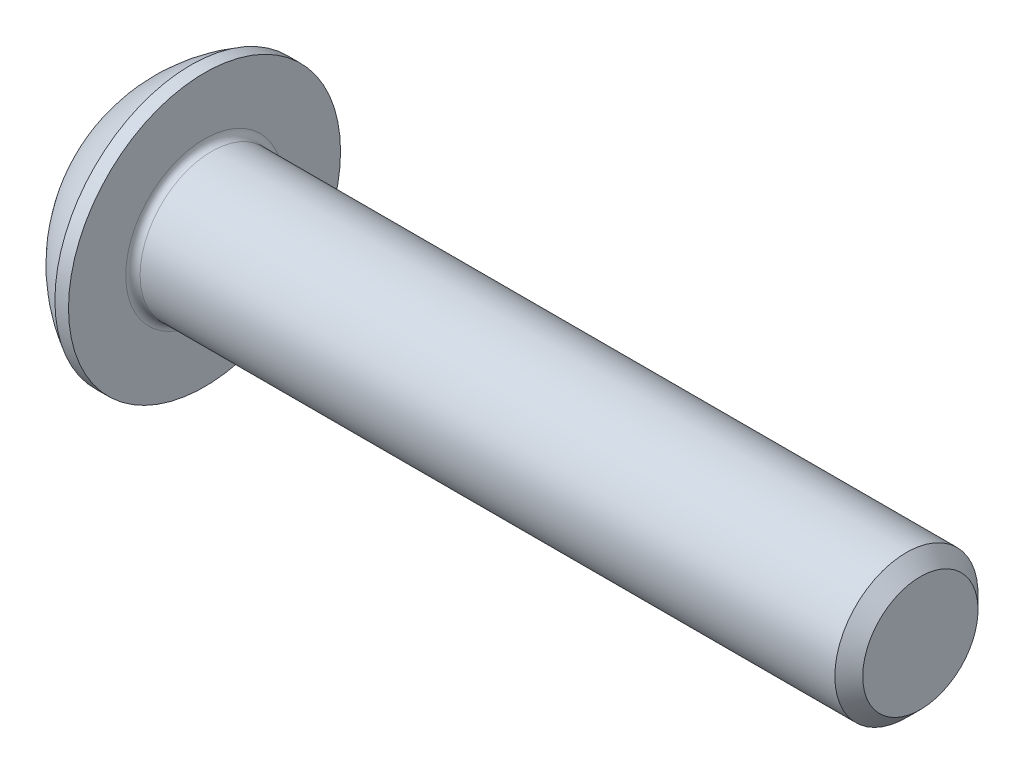
ISO-10303-21;
HEADER;
FILE_DESCRIPTION(('STEP AP214'),'2;1');
FILE_NAME('part.step','',(''),(''),'','','');
FILE_SCHEMA(('AUTOMOTIVE_DESIGN { 1 0 10303 214 1 1 1 1 }'));
ENDSEC;
DATA;
#1=APPLICATION_CONTEXT('core data for automotive mechanical design processes');
#2=APPLICATION_PROTOCOL_DEFINITION('international standard','automotive_design',2000,#1);
#3=PRODUCT_CONTEXT('',#1,'mechanical');
#4=PRODUCT('Part','Part','',(#3));
#5=PRODUCT_RELATED_PRODUCT_CATEGORY('part','',(#4));
#6=PRODUCT_DEFINITION_FORMATION('','',#4);
#7=PRODUCT_DEFINITION_CONTEXT('part definition',#1,'design');
#8=PRODUCT_DEFINITION('design','',#6,#7);
#9=PRODUCT_DEFINITION_SHAPE('','',#8);
#10=(LENGTH_UNIT() NAMED_UNIT(*) SI_UNIT(.MILLI.,.METRE.));
#11=(NAMED_UNIT(*) PLANE_ANGLE_UNIT() SI_UNIT($,.RADIAN.));
#12=(NAMED_UNIT(*) SI_UNIT($,.STERADIAN.) SOLID_ANGLE_UNIT());
#13=UNCERTAINTY_MEASURE_WITH_UNIT(LENGTH_MEASURE(1.E-05),#10,'distance_accuracy_value','');
#14=(GEOMETRIC_REPRESENTATION_CONTEXT(3) GLOBAL_UNCERTAINTY_ASSIGNED_CONTEXT((#13)) GLOBAL_UNIT_ASSIGNED_CONTEXT((#10,
#11,#12)) REPRESENTATION_CONTEXT('',''));
#15=CARTESIAN_POINT('',(0.,0.,0.));
#16=DIRECTION('',(0.,0.,1.));
#17=DIRECTION('',(1.,0.,0.));
#18=AXIS2_PLACEMENT_3D('',#15,#16,#17);
#19=CARTESIAN_POINT('',(0.,0.,0.));
#20=DIRECTION('',(-1.,0.,0.));
#21=DIRECTION('',(0.,0.,1.));
#22=AXIS2_PLACEMENT_3D('',#19,#20,#21);
#23=PLANE('',#22);
#24=CARTESIAN_POINT('',(0.,0.,0.));
#25=DIRECTION('',(-1.,0.,0.));
#26=DIRECTION('',(0.,0.,1.));
#27=AXIS2_PLACEMENT_3D('',#24,#25,#26);
#28=CIRCLE('',#27,1.9);
#29=CARTESIAN_POINT('',(0.,1.9,0.));
#30=VERTEX_POINT('',#29);
#31=EDGE_CURVE('E159',#30,#30,#28,.T.);
#32=ORIENTED_EDGE('',*,*,#31,.T.);
#33=EDGE_LOOP('',(#32));
#34=FACE_BOUND('',#33,.T.);
#35=DIRECTION('',(0.,-1.,0.));
#36=VECTOR('',#35,1.);
#37=CARTESIAN_POINT('',(0.,-0.721687836487031,1.25));
#38=LINE('',#37,#36);
#39=CARTESIAN_POINT('',(0.,0.721687836487033,1.25));
#40=VERTEX_POINT('',#39);
#41=CARTESIAN_POINT('',(0.,-0.721687836487031,1.25));
#42=VERTEX_POINT('',#41);
#43=EDGE_CURVE('E54',#40,#42,#38,.T.);
#44=ORIENTED_EDGE('',*,*,#43,.T.);
#45=DIRECTION('',(0.,-0.5,-0.866025403784438));
#46=VECTOR('',#45,1.);
#47=CARTESIAN_POINT('',(0.,-1.44337567297406,0.));
#48=LINE('',#47,#46);
#49=CARTESIAN_POINT('',(0.,-1.44337567297406,0.));
#50=VERTEX_POINT('',#49);
#51=EDGE_CURVE('E279',#42,#50,#48,.T.);
#52=ORIENTED_EDGE('',*,*,#51,.T.);
#53=DIRECTION('',(0.,0.5,-0.866025403784438));
#54=VECTOR('',#53,1.);
#55=CARTESIAN_POINT('',(0.,-0.721687836487032,-1.25));
#56=LINE('',#55,#54);
#57=CARTESIAN_POINT('',(0.,-0.721687836487032,-1.25));
#58=VERTEX_POINT('',#57);
#59=EDGE_CURVE('E134',#50,#58,#56,.T.);
#60=ORIENTED_EDGE('',*,*,#59,.T.);
#61=DIRECTION('',(0.,1.,0.));
#62=VECTOR('',#61,1.);
#63=CARTESIAN_POINT('',(0.,0.721687836487033,-1.25));
#64=LINE('',#63,#62);
#65=CARTESIAN_POINT('',(0.,0.721687836487033,-1.25));
#66=VERTEX_POINT('',#65);
#67=EDGE_CURVE('E282',#58,#66,#64,.T.);
#68=ORIENTED_EDGE('',*,*,#67,.T.);
#69=DIRECTION('',(0.,0.5,0.866025403784439));
#70=VECTOR('',#69,1.);
#71=CARTESIAN_POINT('',(0.,1.44337567297406,0.));
#72=LINE('',#71,#70);
#73=CARTESIAN_POINT('',(0.,1.44337567297406,0.));
#74=VERTEX_POINT('',#73);
#75=EDGE_CURVE('E284',#66,#74,#72,.T.);
#76=ORIENTED_EDGE('',*,*,#75,.T.);
#77=DIRECTION('',(0.,-0.5,0.866025403784439));
#78=VECTOR('',#77,1.);
#79=CARTESIAN_POINT('',(0.,0.721687836487033,1.25));
#80=LINE('',#79,#78);
#81=EDGE_CURVE('E286',#74,#40,#80,.T.);
#82=ORIENTED_EDGE('',*,*,#81,.T.);
#83=EDGE_LOOP('',(#44,#52,#60,#68,#76,#82));
#84=FACE_BOUND('',#83,.T.);
#85=ADVANCED_FACE('F39',(#34,#84),#23,.T.);
#86=CARTESIAN_POINT('',(3.88527472527473,0.,0.));
#87=DIRECTION('',(-1.,0.,0.));
#88=DIRECTION('',(0.,1.,0.));
#89=AXIS2_PLACEMENT_3D('',#86,#87,#88);
#90=SPHERICAL_SURFACE('',#89,4.3249693283142);
#91=CARTESIAN_POINT('',(1.82,0.,0.));
#92=DIRECTION('',(-1.,0.,0.));
#93=DIRECTION('',(0.,0.,1.));
#94=AXIS2_PLACEMENT_3D('',#91,#92,#93);
#95=CIRCLE('',#94,3.8);
#96=CARTESIAN_POINT('',(1.82,3.8,0.));
#97=VERTEX_POINT('',#96);
#98=EDGE_CURVE('E156',#97,#97,#95,.T.);
#99=CARTESIAN_POINT('',(1.82,3.8,0.));
#100=CARTESIAN_POINT('',(1.79553223778235,3.78670197498787,0.));
#101=CARTESIAN_POINT('',(1.77119294730718,3.77316757105695,0.));
#102=CARTESIAN_POINT('',(1.72278031308152,3.74563119292022,0.));
#103=CARTESIAN_POINT('',(1.69870696933103,3.73162921871441,0.));
#104=CARTESIAN_POINT('',(1.65083523179446,3.7031628875906,0.));
#105=CARTESIAN_POINT('',(1.62703683800837,3.6886985306726,0.));
#106=CARTESIAN_POINT('',(1.57972387446203,3.65931284095831,0.));
#107=CARTESIAN_POINT('',(1.55620930470177,3.64439150816201,0.));
#108=CARTESIAN_POINT('',(1.50947276449225,3.61409743150663,0.));
#109=CARTESIAN_POINT('',(1.48625079404298,3.59872468764754,0.));
#110=CARTESIAN_POINT('',(1.44010811665664,3.56753352546924,0.));
#111=CARTESIAN_POINT('',(1.41718740971957,3.55171510715004,0.));
#112=CARTESIAN_POINT('',(1.37165581166264,3.51963849804541,0.));
#113=CARTESIAN_POINT('',(1.34904492054277,3.50338030725998,0.));
#114=CARTESIAN_POINT('',(1.30414139068938,3.47043021954608,0.));
#115=CARTESIAN_POINT('',(1.28184875195586,3.45373832261761,0.));
#116=CARTESIAN_POINT('',(1.23759004473439,3.41992705070111,0.));
#117=CARTESIAN_POINT('',(1.21562397624644,3.40280767571308,0.));
#118=CARTESIAN_POINT('',(1.17202660551528,3.3681478352793,0.));
#119=CARTESIAN_POINT('',(1.15039530327208,3.35060736983354,0.));
#120=CARTESIAN_POINT('',(1.10747553612391,3.31511189319918,0.));
#121=CARTESIAN_POINT('',(1.08618707121895,3.29715688201057,0.));
#122=CARTESIAN_POINT('',(1.04396092192025,3.26083901328234,0.));
#123=CARTESIAN_POINT('',(1.02302323752651,3.24247615574272,0.));
#124=CARTESIAN_POINT('',(0.981506461539865,3.20534944588,0.));
#125=CARTESIAN_POINT('',(0.960927369946952,3.18658559355691,0.));
#126=CARTESIAN_POINT('',(0.920135458052999,3.14866389531445,0.));
#127=CARTESIAN_POINT('',(0.899922637751959,3.12950604939509,0.));
#128=CARTESIAN_POINT('',(0.859870810269304,3.09080351215454,0.));
#129=CARTESIAN_POINT('',(0.840031803087689,3.07125882083336,0.));
#130=CARTESIAN_POINT('',(0.800735004193913,3.0317898853238,0.));
#131=CARTESIAN_POINT('',(0.781277212481752,3.01186564113541,0.));
#132=CARTESIAN_POINT('',(0.74275010463742,2.97164503404517,0.));
#133=CARTESIAN_POINT('',(0.723680788505248,2.95134867114332,0.));
#134=CARTESIAN_POINT('',(0.685937746983035,2.91039139962521,0.));
#135=CARTESIAN_POINT('',(0.667264021592993,2.88973049100894,0.));
#136=CARTESIAN_POINT('',(0.630319129113973,2.84805183708071,0.));
#137=CARTESIAN_POINT('',(0.612047962024995,2.82703409176873,0.));
#138=CARTESIAN_POINT('',(0.575915003504076,2.78464960661105,0.));
#139=CARTESIAN_POINT('',(0.558053212072135,2.76328286676534,0.));
#140=CARTESIAN_POINT('',(0.522745669474638,2.72020836491933,0.));
#141=CARTESIAN_POINT('',(0.505299918309082,2.69850060291903,0.));
#142=CARTESIAN_POINT('',(0.470830965620254,2.65475215638556,0.));
#143=CARTESIAN_POINT('',(0.453807764096982,2.63271147185239,0.));
#144=CARTESIAN_POINT('',(0.420190262406822,2.58830540409509,0.));
#145=CARTESIAN_POINT('',(0.403595962239933,2.56594002087097,0.));
#146=CARTESIAN_POINT('',(0.370842454943266,2.52089290072626,0.));
#147=CARTESIAN_POINT('',(0.354683247813488,2.49821116380567,0.));
#148=CARTESIAN_POINT('',(0.322805955934171,2.45253979929826,0.));
#149=CARTESIAN_POINT('',(0.307087871184631,2.42955017171145,0.));
#150=CARTESIAN_POINT('',(0.27609868879919,2.38327160379141,0.));
#151=CARTESIAN_POINT('',(0.260827591163289,2.35998266345817,0.));
#152=CARTESIAN_POINT('',(0.230738081024335,2.31311415961106,0.));
#153=CARTESIAN_POINT('',(0.215919668521283,2.28953459609717,0.));
#154=CARTESIAN_POINT('',(0.186741057514276,2.24209364401867,0.));
#155=CARTESIAN_POINT('',(0.172380859010321,2.21823225545407,0.));
#156=CARTESIAN_POINT('',(0.144124034818958,2.17023655608655,0.));
#157=CARTESIAN_POINT('',(0.130227409131549,2.14610224528364,0.));
#158=CARTESIAN_POINT('',(0.102902912986767,2.09756970784785,0.));
#159=CARTESIAN_POINT('',(0.0894750425293921,2.07317148121498,0.));
#160=CARTESIAN_POINT('',(0.0630930771761369,2.02412021042083,0.));
#161=CARTESIAN_POINT('',(0.0501389822802563,1.99946716625955,0.));
#162=CARTESIAN_POINT('',(0.0247093637594986,1.94991547834234,0.));
#163=CARTESIAN_POINT('',(0.0122338401346214,1.9250168345864,0.));
#164=CARTESIAN_POINT('',(0.,1.9,0.));
#165=B_SPLINE_CURVE_WITH_KNOTS('',3,(#99,#100,#101,#102,#103,#104,#105,#106,#107,#108,#109,#110,
#111,#112,#113,#114,#115,#116,#117,#118,#119,#120,#121,#122,#123,#124,#125,#126,#127,#128,#129,
#130,#131,#132,#133,#134,#135,#136,#137,#138,#139,#140,#141,#142,#143,#144,#145,#146,#147,#148,
#149,#150,#151,#152,#153,#154,#155,#156,#157,#158,#159,#160,#161,#162,#163,#164),.UNSPECIFIED.,
.F.,.F.,(4,2,2,2,2,2,2,2,2,2,2,2,2,2,2,2,2,2,2,2,2,2,2,2,2,2,2,2,2,2,2,2,4),(0.,
0.083542578086179,0.167085156172358,0.250627734258538,0.334170312344717,0.417712890430896,
0.501255468517075,0.584798046603254,0.668340624689434,0.751883202775613,0.835425780861792,
0.918968358947971,1.00251093703415,1.08605351512033,1.16959609320651,1.25313867129269,
1.33668124937887,1.42022382746505,1.50376640555123,1.5873089836374,1.67085156172358,
1.75439413980976,1.83793671789594,1.92147929598212,2.0050218740683,2.08856445215448,
2.17210703024066,2.25564960832684,2.33919218641302,2.4227347644992,2.50627734258538,
2.58981992067156,2.67336249875773),.UNSPECIFIED.);
#166=EDGE_CURVE('BSEAM181',#97,#30,#165,.T.);
#167=ORIENTED_EDGE('',*,*,#98,.T.);
#168=ORIENTED_EDGE('',*,*,#31,.F.);
#169=ORIENTED_EDGE('',*,*,#166,.T.);
#170=ORIENTED_EDGE('',*,*,#166,.F.);
#171=EDGE_LOOP('',(#167,#169,#168,#170));
#172=FACE_BOUND('',#171,.T.);
#173=ADVANCED_FACE('F181',(#172),#90,.T.);
#174=CARTESIAN_POINT('',(0.,0.,0.));
#175=DIRECTION('',(-1.,0.,0.));
#176=DIRECTION('',(0.,0.,1.));
#177=AXIS2_PLACEMENT_3D('',#174,#175,#176);
#178=CYLINDRICAL_SURFACE('',#177,3.8);
#179=ORIENTED_EDGE('',*,*,#98,.F.);
#180=EDGE_LOOP('',(#179));
#181=FACE_BOUND('',#180,.T.);
#182=CARTESIAN_POINT('',(2.2,0.,0.));
#183=DIRECTION('',(-1.,0.,0.));
#184=DIRECTION('',(0.,0.,1.));
#185=AXIS2_PLACEMENT_3D('',#182,#183,#184);
#186=CIRCLE('',#185,3.8);
#187=CARTESIAN_POINT('',(2.2,0.,3.8));
#188=VERTEX_POINT('',#187);
#189=EDGE_CURVE('E153',#188,#188,#186,.T.);
#190=ORIENTED_EDGE('',*,*,#189,.T.);
#191=EDGE_LOOP('',(#190));
#192=FACE_BOUND('',#191,.T.);
#193=ADVANCED_FACE('F186',(#181,#192),#178,.T.);
#194=CARTESIAN_POINT('',(2.2,2.,0.));
#195=DIRECTION('',(-1.,0.,0.));
#196=DIRECTION('',(0.,0.,1.));
#197=AXIS2_PLACEMENT_3D('',#194,#195,#196);
#198=PLANE('',#197);
#199=CARTESIAN_POINT('',(2.2,0.,0.));
#200=DIRECTION('',(-1.,0.,0.));
#201=DIRECTION('',(0.,0.,1.));
#202=AXIS2_PLACEMENT_3D('',#199,#200,#201);
#203=CIRCLE('',#202,2.2);
#204=CARTESIAN_POINT('',(2.2,0.,2.2));
#205=VERTEX_POINT('',#204);
#206=EDGE_CURVE('E47',#205,#205,#203,.T.);
#207=ORIENTED_EDGE('',*,*,#206,.T.);
#208=EDGE_LOOP('',(#207));
#209=FACE_BOUND('',#208,.T.);
#210=ORIENTED_EDGE('',*,*,#189,.F.);
#211=EDGE_LOOP('',(#210));
#212=FACE_BOUND('',#211,.T.);
#213=ADVANCED_FACE('F164',(#209,#212),#198,.F.);
#214=CARTESIAN_POINT('',(0.,0.,0.));
#215=DIRECTION('',(-1.,0.,0.));
#216=DIRECTION('',(0.,0.,1.));
#217=AXIS2_PLACEMENT_3D('',#214,#215,#216);
#218=CYLINDRICAL_SURFACE('',#217,2.);
#219=CARTESIAN_POINT('',(2.4,0.,0.));
#220=DIRECTION('',(-1.,0.,0.));
#221=DIRECTION('',(0.,0.,1.));
#222=AXIS2_PLACEMENT_3D('',#219,#220,#221);
#223=CIRCLE('',#222,2.);
#224=CARTESIAN_POINT('',(2.4,0.,2.));
#225=VERTEX_POINT('',#224);
#226=EDGE_CURVE('E11',#225,#225,#223,.F.);
#227=ORIENTED_EDGE('',*,*,#226,.T.);
#228=EDGE_LOOP('',(#227));
#229=FACE_BOUND('',#228,.T.);
#230=CARTESIAN_POINT('',(21.81,0.,0.));
#231=DIRECTION('',(-1.,0.,0.));
#232=DIRECTION('',(0.,0.,1.));
#233=AXIS2_PLACEMENT_3D('',#230,#231,#232);
#234=CIRCLE('',#233,2.);
#235=CARTESIAN_POINT('',(21.81,0.,2.));
#236=VERTEX_POINT('',#235);
#237=EDGE_CURVE('E150',#236,#236,#234,.T.);
#238=ORIENTED_EDGE('',*,*,#237,.T.);
#239=EDGE_LOOP('',(#238));
#240=FACE_BOUND('',#239,.T.);
#241=ADVANCED_FACE('F195',(#229,#240),#218,.T.);
#242=CARTESIAN_POINT('',(22.2,0.,0.));
#243=DIRECTION('',(-1.,0.,0.));
#244=DIRECTION('',(0.,0.,1.));
#245=AXIS2_PLACEMENT_3D('',#242,#243,#244);
#246=CONICAL_SURFACE('',#245,1.61,0.785398163397444);
#247=ORIENTED_EDGE('',*,*,#237,.F.);
#248=EDGE_LOOP('',(#247));
#249=FACE_BOUND('',#248,.T.);
#250=CARTESIAN_POINT('',(22.2,0.,0.));
#251=DIRECTION('',(-1.,0.,0.));
#252=DIRECTION('',(0.,0.,1.));
#253=AXIS2_PLACEMENT_3D('',#250,#251,#252);
#254=CIRCLE('',#253,1.61);
#255=CARTESIAN_POINT('',(22.2,0.,1.61));
#256=VERTEX_POINT('',#255);
#257=EDGE_CURVE('E146',#256,#256,#254,.T.);
#258=ORIENTED_EDGE('',*,*,#257,.T.);
#259=EDGE_LOOP('',(#258));
#260=FACE_BOUND('',#259,.T.);
#261=ADVANCED_FACE('F177',(#249,#260),#246,.T.);
#262=CARTESIAN_POINT('',(22.2,0.,0.));
#263=DIRECTION('',(-1.,0.,0.));
#264=DIRECTION('',(0.,0.,1.));
#265=AXIS2_PLACEMENT_3D('',#262,#263,#264);
#266=PLANE('',#265);
#267=ORIENTED_EDGE('',*,*,#257,.F.);
#268=EDGE_LOOP('',(#267));
#269=FACE_BOUND('',#268,.T.);
#270=ADVANCED_FACE('F168',(#269),#266,.F.);
#271=CARTESIAN_POINT('',(2.4,0.,0.));
#272=DIRECTION('',(-1.,0.,0.));
#273=DIRECTION('',(0.,0.,1.));
#274=AXIS2_PLACEMENT_3D('',#271,#272,#273);
#275=TOROIDAL_SURFACE('',#274,2.2,0.2);
#276=ORIENTED_EDGE('',*,*,#226,.F.);
#277=EDGE_LOOP('',(#276));
#278=FACE_BOUND('',#277,.T.);
#279=ORIENTED_EDGE('',*,*,#206,.F.);
#280=EDGE_LOOP('',(#279));
#281=FACE_BOUND('',#280,.T.);
#282=ADVANCED_FACE('F41',(#278,#281),#275,.F.);
#283=CARTESIAN_POINT('',(1.3,-1.44337567297406,0.));
#284=DIRECTION('',(0.,0.866025403784438,-0.5));
#285=DIRECTION('',(0.,0.5,0.866025403784438));
#286=AXIS2_PLACEMENT_3D('',#283,#284,#285);
#287=PLANE('',#286);
#288=DIRECTION('',(0.,-0.5,-0.866025403784438));
#289=VECTOR('',#288,1.);
#290=CARTESIAN_POINT('',(1.3,-1.44337567297406,0.));
#291=LINE('',#290,#289);
#292=CARTESIAN_POINT('',(1.3,-0.721687836487031,1.25));
#293=VERTEX_POINT('',#292);
#294=CARTESIAN_POINT('',(1.3,-1.08253175473055,0.625));
#295=VERTEX_POINT('',#294);
#296=EDGE_CURVE('E120',#293,#295,#291,.T.);
#297=ORIENTED_EDGE('',*,*,#296,.T.);
#298=CARTESIAN_POINT('',(1.3,-1.44337567297406,0.));
#299=VERTEX_POINT('',#298);
#300=EDGE_CURVE('E115',#295,#299,#291,.T.);
#301=ORIENTED_EDGE('',*,*,#300,.T.);
#302=DIRECTION('',(-1.,0.,0.));
#303=VECTOR('',#302,1.);
#304=CARTESIAN_POINT('',(1.3,-1.44337567297406,0.));
#305=LINE('',#304,#303);
#306=EDGE_CURVE('E117',#299,#50,#305,.T.);
#307=ORIENTED_EDGE('',*,*,#306,.T.);
#308=ORIENTED_EDGE('',*,*,#51,.F.);
#309=DIRECTION('',(-1.,0.,0.));
#310=VECTOR('',#309,1.);
#311=CARTESIAN_POINT('',(1.3,-0.721687836487031,1.25));
#312=LINE('',#311,#310);
#313=EDGE_CURVE('E275',#293,#42,#312,.T.);
#314=ORIENTED_EDGE('',*,*,#313,.F.);
#315=EDGE_LOOP('',(#297,#301,#307,#308,#314));
#316=FACE_BOUND('',#315,.T.);
#317=ADVANCED_FACE('F116',(#316),#287,.T.);
#318=CARTESIAN_POINT('',(1.3,-0.721687836487032,-1.25));
#319=DIRECTION('',(0.,0.866025403784438,0.5));
#320=DIRECTION('',(0.,-0.5,0.866025403784439));
#321=AXIS2_PLACEMENT_3D('',#318,#319,#320);
#322=PLANE('',#321);
#323=DIRECTION('',(0.,0.5,-0.866025403784438));
#324=VECTOR('',#323,1.);
#325=CARTESIAN_POINT('',(1.3,-0.721687836487032,-1.25));
#326=LINE('',#325,#324);
#327=CARTESIAN_POINT('',(1.3,-1.08253175473055,-0.625000000000001));
#328=VERTEX_POINT('',#327);
#329=EDGE_CURVE('E62',#299,#328,#326,.T.);
#330=ORIENTED_EDGE('',*,*,#329,.T.);
#331=CARTESIAN_POINT('',(1.3,-0.721687836487032,-1.25));
#332=VERTEX_POINT('',#331);
#333=EDGE_CURVE('E129',#328,#332,#326,.T.);
#334=ORIENTED_EDGE('',*,*,#333,.T.);
#335=DIRECTION('',(-1.,0.,0.));
#336=VECTOR('',#335,1.);
#337=CARTESIAN_POINT('',(1.3,-0.721687836487032,-1.25));
#338=LINE('',#337,#336);
#339=EDGE_CURVE('E136',#332,#58,#338,.T.);
#340=ORIENTED_EDGE('',*,*,#339,.T.);
#341=ORIENTED_EDGE('',*,*,#59,.F.);
#342=ORIENTED_EDGE('',*,*,#306,.F.);
#343=EDGE_LOOP('',(#330,#334,#340,#341,#342));
#344=FACE_BOUND('',#343,.T.);
#345=ADVANCED_FACE('F132',(#344),#322,.T.);
#346=CARTESIAN_POINT('',(1.3,0.721687836487033,-1.25));
#347=DIRECTION('',(0.,0.,1.));
#348=DIRECTION('',(1.,0.,0.));
#349=AXIS2_PLACEMENT_3D('',#346,#347,#348);
#350=PLANE('',#349);
#351=DIRECTION('',(0.,1.,0.));
#352=VECTOR('',#351,1.);
#353=CARTESIAN_POINT('',(1.3,0.721687836487033,-1.25));
#354=LINE('',#353,#352);
#355=CARTESIAN_POINT('',(1.3,0.,-1.25));
#356=VERTEX_POINT('',#355);
#357=EDGE_CURVE('E256',#332,#356,#354,.T.);
#358=ORIENTED_EDGE('',*,*,#357,.T.);
#359=CARTESIAN_POINT('',(1.3,0.721687836487033,-1.25));
#360=VERTEX_POINT('',#359);
#361=EDGE_CURVE('E128',#356,#360,#354,.T.);
#362=ORIENTED_EDGE('',*,*,#361,.T.);
#363=DIRECTION('',(-1.,0.,0.));
#364=VECTOR('',#363,1.);
#365=CARTESIAN_POINT('',(1.3,0.721687836487033,-1.25));
#366=LINE('',#365,#364);
#367=EDGE_CURVE('E141',#360,#66,#366,.T.);
#368=ORIENTED_EDGE('',*,*,#367,.T.);
#369=ORIENTED_EDGE('',*,*,#67,.F.);
#370=ORIENTED_EDGE('',*,*,#339,.F.);
#371=EDGE_LOOP('',(#358,#362,#368,#369,#370));
#372=FACE_BOUND('',#371,.T.);
#373=ADVANCED_FACE('F208',(#372),#350,.T.);
#374=CARTESIAN_POINT('',(1.3,1.44337567297406,0.));
#375=DIRECTION('',(0.,-0.866025403784439,0.5));
#376=DIRECTION('',(0.,-0.5,-0.866025403784439));
#377=AXIS2_PLACEMENT_3D('',#374,#375,#376);
#378=PLANE('',#377);
#379=DIRECTION('',(0.,0.5,0.866025403784439));
#380=VECTOR('',#379,1.);
#381=CARTESIAN_POINT('',(1.3,1.44337567297406,0.));
#382=LINE('',#381,#380);
#383=CARTESIAN_POINT('',(1.3,1.08253175473055,-0.625));
#384=VERTEX_POINT('',#383);
#385=EDGE_CURVE('E245',#360,#384,#382,.T.);
#386=ORIENTED_EDGE('',*,*,#385,.T.);
#387=CARTESIAN_POINT('',(1.3,1.44337567297406,0.));
#388=VERTEX_POINT('',#387);
#389=EDGE_CURVE('E250',#384,#388,#382,.T.);
#390=ORIENTED_EDGE('',*,*,#389,.T.);
#391=DIRECTION('',(-1.,0.,0.));
#392=VECTOR('',#391,1.);
#393=CARTESIAN_POINT('',(1.3,1.44337567297406,0.));
#394=LINE('',#393,#392);
#395=EDGE_CURVE('E290',#388,#74,#394,.T.);
#396=ORIENTED_EDGE('',*,*,#395,.T.);
#397=ORIENTED_EDGE('',*,*,#75,.F.);
#398=ORIENTED_EDGE('',*,*,#367,.F.);
#399=EDGE_LOOP('',(#386,#390,#396,#397,#398));
#400=FACE_BOUND('',#399,.T.);
#401=ADVANCED_FACE('F211',(#400),#378,.T.);
#402=CARTESIAN_POINT('',(1.3,0.721687836487033,1.25));
#403=DIRECTION('',(0.,-0.866025403784439,-0.5));
#404=DIRECTION('',(0.,0.5,-0.866025403784439));
#405=AXIS2_PLACEMENT_3D('',#402,#403,#404);
#406=PLANE('',#405);
#407=DIRECTION('',(0.,-0.5,0.866025403784439));
#408=VECTOR('',#407,1.);
#409=CARTESIAN_POINT('',(1.3,0.721687836487033,1.25));
#410=LINE('',#409,#408);
#411=CARTESIAN_POINT('',(1.3,1.08253175473055,0.625));
#412=VERTEX_POINT('',#411);
#413=EDGE_CURVE('E253',#388,#412,#410,.T.);
#414=ORIENTED_EDGE('',*,*,#413,.T.);
#415=CARTESIAN_POINT('',(1.3,0.721687836487033,1.25));
#416=VERTEX_POINT('',#415);
#417=EDGE_CURVE('E261',#412,#416,#410,.T.);
#418=ORIENTED_EDGE('',*,*,#417,.T.);
#419=DIRECTION('',(-1.,0.,0.));
#420=VECTOR('',#419,1.);
#421=CARTESIAN_POINT('',(1.3,0.721687836487033,1.25));
#422=LINE('',#421,#420);
#423=EDGE_CURVE('E274',#416,#40,#422,.T.);
#424=ORIENTED_EDGE('',*,*,#423,.T.);
#425=ORIENTED_EDGE('',*,*,#81,.F.);
#426=ORIENTED_EDGE('',*,*,#395,.F.);
#427=EDGE_LOOP('',(#414,#418,#424,#425,#426));
#428=FACE_BOUND('',#427,.T.);
#429=ADVANCED_FACE('F215',(#428),#406,.T.);
#430=CARTESIAN_POINT('',(1.3,-0.721687836487031,1.25));
#431=DIRECTION('',(0.,0.,-1.));
#432=DIRECTION('',(0.,1.,0.));
#433=AXIS2_PLACEMENT_3D('',#430,#431,#432);
#434=PLANE('',#433);
#435=DIRECTION('',(0.,-1.,0.));
#436=VECTOR('',#435,1.);
#437=CARTESIAN_POINT('',(1.3,-0.721687836487031,1.25));
#438=LINE('',#437,#436);
#439=CARTESIAN_POINT('',(1.3,0.,1.25));
#440=VERTEX_POINT('',#439);
#441=EDGE_CURVE('E267',#416,#440,#438,.T.);
#442=ORIENTED_EDGE('',*,*,#441,.T.);
#443=EDGE_CURVE('E269',#440,#293,#438,.T.);
#444=ORIENTED_EDGE('',*,*,#443,.T.);
#445=ORIENTED_EDGE('',*,*,#313,.T.);
#446=ORIENTED_EDGE('',*,*,#43,.F.);
#447=ORIENTED_EDGE('',*,*,#423,.F.);
#448=EDGE_LOOP('',(#442,#444,#445,#446,#447));
#449=FACE_BOUND('',#448,.T.);
#450=ADVANCED_FACE('F219',(#449),#434,.T.);
#451=CARTESIAN_POINT('',(1.3,-1.44337567297406,0.));
#452=DIRECTION('',(1.,0.,0.));
#453=DIRECTION('',(0.,0.,-1.));
#454=AXIS2_PLACEMENT_3D('',#451,#452,#453);
#455=PLANE('',#454);
#456=CARTESIAN_POINT('',(1.3,0.,0.));
#457=DIRECTION('',(-1.,0.,0.));
#458=DIRECTION('',(0.,0.,1.));
#459=AXIS2_PLACEMENT_3D('',#456,#457,#458);
#460=CIRCLE('',#459,1.25);
#461=EDGE_CURVE('E242',#384,#356,#460,.T.);
#462=ORIENTED_EDGE('',*,*,#461,.F.);
#463=ORIENTED_EDGE('',*,*,#385,.F.);
#464=ORIENTED_EDGE('',*,*,#361,.F.);
#465=EDGE_LOOP('',(#462,#463,#464));
#466=FACE_BOUND('',#465,.T.);
#467=ADVANCED_FACE('F223',(#466),#455,.F.);
#468=EDGE_CURVE('E147',#412,#384,#460,.T.);
#469=ORIENTED_EDGE('',*,*,#468,.F.);
#470=ORIENTED_EDGE('',*,*,#413,.F.);
#471=ORIENTED_EDGE('',*,*,#389,.F.);
#472=EDGE_LOOP('',(#469,#470,#471));
#473=FACE_BOUND('',#472,.T.);
#474=ADVANCED_FACE('F232',(#473),#455,.F.);
#475=EDGE_CURVE('E140',#440,#412,#460,.T.);
#476=ORIENTED_EDGE('',*,*,#475,.F.);
#477=ORIENTED_EDGE('',*,*,#441,.F.);
#478=ORIENTED_EDGE('',*,*,#417,.F.);
#479=EDGE_LOOP('',(#476,#477,#478));
#480=FACE_BOUND('',#479,.T.);
#481=ADVANCED_FACE('F237',(#480),#455,.F.);
#482=EDGE_CURVE('E135',#295,#440,#460,.T.);
#483=ORIENTED_EDGE('',*,*,#482,.F.);
#484=ORIENTED_EDGE('',*,*,#296,.F.);
#485=ORIENTED_EDGE('',*,*,#443,.F.);
#486=EDGE_LOOP('',(#483,#484,#485));
#487=FACE_BOUND('',#486,.T.);
#488=ADVANCED_FACE('F230',(#487),#455,.F.);
#489=EDGE_CURVE('E126',#328,#295,#460,.T.);
#490=ORIENTED_EDGE('',*,*,#489,.F.);
#491=ORIENTED_EDGE('',*,*,#329,.F.);
#492=ORIENTED_EDGE('',*,*,#300,.F.);
#493=EDGE_LOOP('',(#490,#491,#492));
#494=FACE_BOUND('',#493,.T.);
#495=ADVANCED_FACE('F125',(#494),#455,.F.);
#496=EDGE_CURVE('E248',#356,#328,#460,.T.);
#497=ORIENTED_EDGE('',*,*,#496,.F.);
#498=ORIENTED_EDGE('',*,*,#357,.F.);
#499=ORIENTED_EDGE('',*,*,#333,.F.);
#500=EDGE_LOOP('',(#497,#498,#499));
#501=FACE_BOUND('',#500,.T.);
#502=ADVANCED_FACE('F203',(#501),#455,.F.);
#503=CARTESIAN_POINT('',(2.02168783648704,0.,0.));
#504=DIRECTION('',(-1.,0.,0.));
#505=DIRECTION('',(0.,0.,1.));
#506=AXIS2_PLACEMENT_3D('',#503,#504,#505);
#507=CONICAL_SURFACE('',#506,0.,1.04719755119659);
#508=ORIENTED_EDGE('',*,*,#475,.T.);
#509=ORIENTED_EDGE('',*,*,#468,.T.);
#510=ORIENTED_EDGE('',*,*,#461,.T.);
#511=ORIENTED_EDGE('',*,*,#496,.T.);
#512=ORIENTED_EDGE('',*,*,#489,.T.);
#513=ORIENTED_EDGE('',*,*,#482,.T.);
#514=EDGE_LOOP('',(#508,#509,#510,#511,#512,#513));
#515=FACE_BOUND('',#514,.T.);
#516=CARTESIAN_POINT('',(2.02168783648704,0.,0.));
#517=VERTEX_POINT('',#516);
#518=VERTEX_LOOP('',#517);
#519=FACE_BOUND('',#518,.T.);
#520=ADVANCED_FACE('F201',(#515,#519),#507,.F.);
#521=CLOSED_SHELL('',(#85,#173,#193,#213,#241,#261,#270,#282,#317,#345,#373,#401,#429,#450,#467,
#474,#481,#488,#495,#502,#520));
#522=MANIFOLD_SOLID_BREP('B2',#521);
#523=ADVANCED_BREP_SHAPE_REPRESENTATION('',(#18,#522),#14);
#524=SHAPE_DEFINITION_REPRESENTATION(#9,#523);
ENDSEC;
END-ISO-10303-21;
